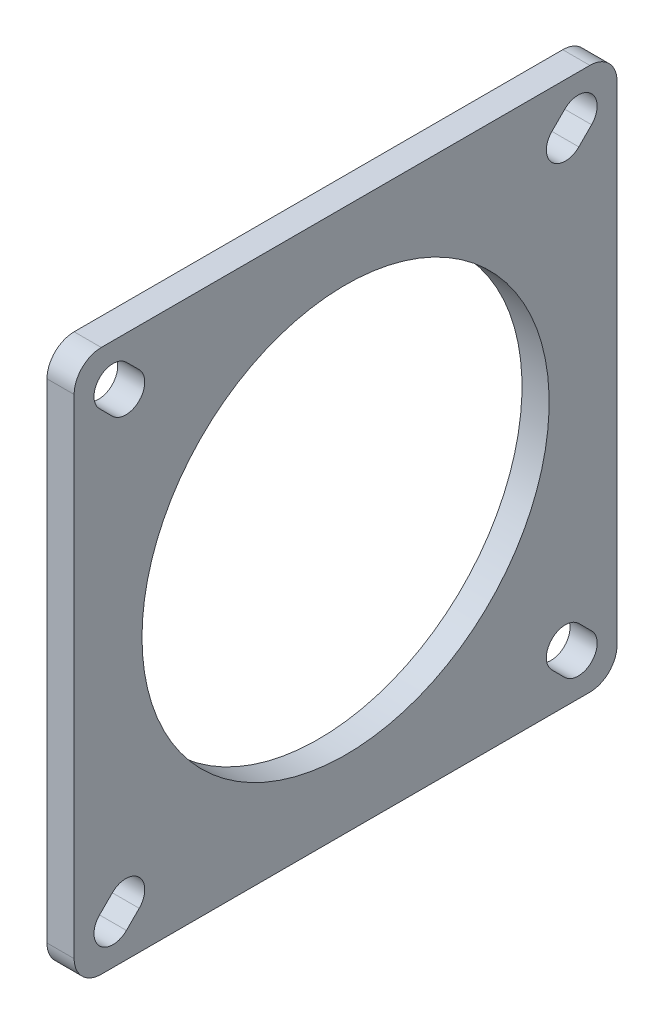
ISO-10303-21;
HEADER;
FILE_DESCRIPTION(('STEP AP214'),'2;1');
FILE_NAME('part.step','',(''),(''),'','','');
FILE_SCHEMA(('AUTOMOTIVE_DESIGN { 1 0 10303 214 1 1 1 1 }'));
ENDSEC;
DATA;
#1=APPLICATION_CONTEXT('core data for automotive mechanical design processes');
#2=APPLICATION_PROTOCOL_DEFINITION('international standard','automotive_design',2000,#1);
#3=PRODUCT_CONTEXT('',#1,'mechanical');
#4=PRODUCT('Part','Part','',(#3));
#5=PRODUCT_RELATED_PRODUCT_CATEGORY('part','',(#4));
#6=PRODUCT_DEFINITION_FORMATION('','',#4);
#7=PRODUCT_DEFINITION_CONTEXT('part definition',#1,'design');
#8=PRODUCT_DEFINITION('design','',#6,#7);
#9=PRODUCT_DEFINITION_SHAPE('','',#8);
#10=(LENGTH_UNIT() NAMED_UNIT(*) SI_UNIT(.MILLI.,.METRE.));
#11=(NAMED_UNIT(*) PLANE_ANGLE_UNIT() SI_UNIT($,.RADIAN.));
#12=(NAMED_UNIT(*) SI_UNIT($,.STERADIAN.) SOLID_ANGLE_UNIT());
#13=UNCERTAINTY_MEASURE_WITH_UNIT(LENGTH_MEASURE(1.E-05),#10,'distance_accuracy_value','');
#14=(GEOMETRIC_REPRESENTATION_CONTEXT(3) GLOBAL_UNCERTAINTY_ASSIGNED_CONTEXT((#13)) GLOBAL_UNIT_ASSIGNED_CONTEXT((#10,
#11,#12)) REPRESENTATION_CONTEXT('',''));
#15=CARTESIAN_POINT('',(0.,0.,0.));
#16=DIRECTION('',(0.,0.,1.));
#17=DIRECTION('',(1.,0.,0.));
#18=AXIS2_PLACEMENT_3D('',#15,#16,#17);
#19=CARTESIAN_POINT('',(0.,22.5,0.));
#20=DIRECTION('',(1.,0.,0.));
#21=DIRECTION('',(0.,0.,-1.));
#22=AXIS2_PLACEMENT_3D('',#19,#20,#21);
#23=PLANE('',#22);
#24=DIRECTION('',(0.,-0.707106781186549,-0.707106781186546));
#25=VECTOR('',#24,1.);
#26=CARTESIAN_POINT('',(0.,-27.1920310216784,-24.222182540695));
#27=LINE('',#26,#25);
#28=CARTESIAN_POINT('',(0.,-27.1920310216784,-24.222182540695));
#29=VERTEX_POINT('',#28);
#30=CARTESIAN_POINT('',(0.,-25.7778174593053,-22.8079689783219));
#31=VERTEX_POINT('',#30);
#32=EDGE_CURVE('E369',#29,#31,#27,.F.);
#33=ORIENTED_EDGE('',*,*,#32,.F.);
#34=CARTESIAN_POINT('',(0.,-25.7071067811866,-25.7071067811867));
#35=DIRECTION('',(-1.,0.,0.));
#36=DIRECTION('',(0.,0.,1.));
#37=AXIS2_PLACEMENT_3D('',#34,#35,#36);
#38=CIRCLE('',#37,2.1);
#39=CARTESIAN_POINT('',(0.,-24.2221825406949,-27.1920310216785));
#40=VERTEX_POINT('',#39);
#41=EDGE_CURVE('E216',#40,#29,#38,.T.);
#42=ORIENTED_EDGE('',*,*,#41,.F.);
#43=DIRECTION('',(0.,0.707106781186546,0.707106781186549));
#44=VECTOR('',#43,1.);
#45=CARTESIAN_POINT('',(0.,-24.2221825406949,-27.1920310216785));
#46=LINE('',#45,#44);
#47=CARTESIAN_POINT('',(0.,-22.8079689783218,-25.7778174593054));
#48=VERTEX_POINT('',#47);
#49=EDGE_CURVE('E373',#48,#40,#46,.F.);
#50=ORIENTED_EDGE('',*,*,#49,.F.);
#51=CARTESIAN_POINT('',(0.,-24.2928932188135,-24.2928932188136));
#52=DIRECTION('',(-1.,0.,0.));
#53=DIRECTION('',(0.,0.,1.));
#54=AXIS2_PLACEMENT_3D('',#51,#52,#53);
#55=CIRCLE('',#54,2.09999999999999);
#56=EDGE_CURVE('E371',#31,#48,#55,.T.);
#57=ORIENTED_EDGE('',*,*,#56,.F.);
#58=EDGE_LOOP('',(#33,#42,#50,#57));
#59=FACE_BOUND('',#58,.T.);
#60=DIRECTION('',(0.,-0.707106781186548,0.707106781186547));
#61=VECTOR('',#60,1.);
#62=CARTESIAN_POINT('',(0.,-24.2221825406951,27.1920310216783));
#63=LINE('',#62,#61);
#64=CARTESIAN_POINT('',(0.,-24.2221825406951,27.1920310216783));
#65=VERTEX_POINT('',#64);
#66=CARTESIAN_POINT('',(0.,-22.807968978322,25.7778174593052));
#67=VERTEX_POINT('',#66);
#68=EDGE_CURVE('E360',#65,#67,#63,.F.);
#69=ORIENTED_EDGE('',*,*,#68,.F.);
#70=CARTESIAN_POINT('',(0.,-25.7071067811868,25.7071067811865));
#71=DIRECTION('',(-1.,0.,0.));
#72=DIRECTION('',(0.,0.,1.));
#73=AXIS2_PLACEMENT_3D('',#70,#71,#72);
#74=CIRCLE('',#73,2.1);
#75=CARTESIAN_POINT('',(0.,-27.1920310216786,24.2221825406948));
#76=VERTEX_POINT('',#75);
#77=EDGE_CURVE('E366',#76,#65,#74,.T.);
#78=ORIENTED_EDGE('',*,*,#77,.F.);
#79=DIRECTION('',(0.,0.707106781186551,-0.707106781186544));
#80=VECTOR('',#79,1.);
#81=CARTESIAN_POINT('',(0.,-27.1920310216786,24.2221825406948));
#82=LINE('',#81,#80);
#83=CARTESIAN_POINT('',(0.,-25.7778174593055,22.8079689783217));
#84=VERTEX_POINT('',#83);
#85=EDGE_CURVE('E364',#84,#76,#82,.F.);
#86=ORIENTED_EDGE('',*,*,#85,.F.);
#87=CARTESIAN_POINT('',(0.,-24.2928932188137,24.2928932188135));
#88=DIRECTION('',(-1.,0.,0.));
#89=DIRECTION('',(0.,0.,1.));
#90=AXIS2_PLACEMENT_3D('',#87,#88,#89);
#91=CIRCLE('',#90,2.09999999999999);
#92=EDGE_CURVE('E362',#67,#84,#91,.T.);
#93=ORIENTED_EDGE('',*,*,#92,.F.);
#94=EDGE_LOOP('',(#69,#78,#86,#93));
#95=FACE_BOUND('',#94,.T.);
#96=DIRECTION('',(0.,0.707106781186554,0.707106781186541));
#97=VECTOR('',#96,1.);
#98=CARTESIAN_POINT('',(0.,27.1920310216786,24.2221825406948));
#99=LINE('',#98,#97);
#100=CARTESIAN_POINT('',(0.,27.1920310216786,24.2221825406948));
#101=VERTEX_POINT('',#100);
#102=CARTESIAN_POINT('',(0.,25.7778174593054,22.8079689783217));
#103=VERTEX_POINT('',#102);
#104=EDGE_CURVE('E246',#101,#103,#99,.F.);
#105=ORIENTED_EDGE('',*,*,#104,.F.);
#106=CARTESIAN_POINT('',(0.,25.7071067811868,25.7071067811866));
#107=DIRECTION('',(-1.,0.,0.));
#108=DIRECTION('',(0.,0.,1.));
#109=AXIS2_PLACEMENT_3D('',#106,#107,#108);
#110=CIRCLE('',#109,2.1);
#111=CARTESIAN_POINT('',(0.,24.2221825406951,27.1920310216783));
#112=VERTEX_POINT('',#111);
#113=EDGE_CURVE('E357',#112,#101,#110,.T.);
#114=ORIENTED_EDGE('',*,*,#113,.F.);
#115=DIRECTION('',(0.,-0.707106781186551,-0.707106781186544));
#116=VECTOR('',#115,1.);
#117=CARTESIAN_POINT('',(0.,24.2221825406951,27.1920310216783));
#118=LINE('',#117,#116);
#119=CARTESIAN_POINT('',(0.,22.807968978322,25.7778174593052));
#120=VERTEX_POINT('',#119);
#121=EDGE_CURVE('E355',#120,#112,#118,.F.);
#122=ORIENTED_EDGE('',*,*,#121,.F.);
#123=CARTESIAN_POINT('',(0.,24.2928932188137,24.2928932188135));
#124=DIRECTION('',(-1.,0.,0.));
#125=DIRECTION('',(0.,0.,1.));
#126=AXIS2_PLACEMENT_3D('',#123,#124,#125);
#127=CIRCLE('',#126,2.09999999999999);
#128=EDGE_CURVE('E353',#103,#120,#127,.T.);
#129=ORIENTED_EDGE('',*,*,#128,.F.);
#130=EDGE_LOOP('',(#105,#114,#122,#129));
#131=FACE_BOUND('',#130,.T.);
#132=DIRECTION('',(0.,0.707106781186548,-0.707106781186547));
#133=VECTOR('',#132,1.);
#134=CARTESIAN_POINT('',(0.,24.2221825406951,-27.1920310216783));
#135=LINE('',#134,#133);
#136=CARTESIAN_POINT('',(0.,24.2221825406951,-27.1920310216783));
#137=VERTEX_POINT('',#136);
#138=CARTESIAN_POINT('',(0.,22.807968978322,-25.7778174593052));
#139=VERTEX_POINT('',#138);
#140=EDGE_CURVE('E311',#137,#139,#135,.F.);
#141=ORIENTED_EDGE('',*,*,#140,.F.);
#142=CARTESIAN_POINT('',(0.,25.7071067811868,-25.7071067811865));
#143=DIRECTION('',(-1.,0.,0.));
#144=DIRECTION('',(0.,0.,1.));
#145=AXIS2_PLACEMENT_3D('',#142,#143,#144);
#146=CIRCLE('',#145,2.1);
#147=CARTESIAN_POINT('',(0.,27.1920310216786,-24.2221825406948));
#148=VERTEX_POINT('',#147);
#149=EDGE_CURVE('E319',#148,#137,#146,.T.);
#150=ORIENTED_EDGE('',*,*,#149,.F.);
#151=DIRECTION('',(0.,-0.707106781186551,0.707106781186544));
#152=VECTOR('',#151,1.);
#153=CARTESIAN_POINT('',(0.,27.1920310216786,-24.2221825406948));
#154=LINE('',#153,#152);
#155=CARTESIAN_POINT('',(0.,25.7778174593055,-22.8079689783217));
#156=VERTEX_POINT('',#155);
#157=EDGE_CURVE('E348',#156,#148,#154,.F.);
#158=ORIENTED_EDGE('',*,*,#157,.F.);
#159=CARTESIAN_POINT('',(0.,24.2928932188137,-24.2928932188135));
#160=DIRECTION('',(-1.,0.,0.));
#161=DIRECTION('',(0.,0.,1.));
#162=AXIS2_PLACEMENT_3D('',#159,#160,#161);
#163=CIRCLE('',#162,2.09999999999999);
#164=EDGE_CURVE('E346',#139,#156,#163,.T.);
#165=ORIENTED_EDGE('',*,*,#164,.F.);
#166=EDGE_LOOP('',(#141,#150,#158,#165));
#167=FACE_BOUND('',#166,.T.);
#168=CARTESIAN_POINT('',(0.,0.,0.));
#169=DIRECTION('',(-1.,0.,0.));
#170=DIRECTION('',(0.,0.,1.));
#171=AXIS2_PLACEMENT_3D('',#168,#169,#170);
#172=CIRCLE('',#171,22.5);
#173=CARTESIAN_POINT('',(0.,0.,22.5));
#174=VERTEX_POINT('',#173);
#175=EDGE_CURVE('E341',#174,#174,#172,.T.);
#176=ORIENTED_EDGE('',*,*,#175,.F.);
#177=EDGE_LOOP('',(#176));
#178=FACE_BOUND('',#177,.T.);
#179=DIRECTION('',(0.,1.,0.));
#180=VECTOR('',#179,1.);
#181=CARTESIAN_POINT('',(0.,22.5,-30.));
#182=LINE('',#181,#180);
#183=CARTESIAN_POINT('',(0.,-27.,-30.));
#184=VERTEX_POINT('',#183);
#185=CARTESIAN_POINT('',(0.,27.,-30.));
#186=VERTEX_POINT('',#185);
#187=EDGE_CURVE('E335',#184,#186,#182,.T.);
#188=ORIENTED_EDGE('',*,*,#187,.F.);
#189=CARTESIAN_POINT('',(0.,-27.,-27.));
#190=DIRECTION('',(1.,0.,0.));
#191=DIRECTION('',(0.,0.,-1.));
#192=AXIS2_PLACEMENT_3D('',#189,#190,#191);
#193=CIRCLE('',#192,3.);
#194=CARTESIAN_POINT('',(0.,-30.,-27.));
#195=VERTEX_POINT('',#194);
#196=EDGE_CURVE('E386',#184,#195,#193,.F.);
#197=ORIENTED_EDGE('',*,*,#196,.T.);
#198=DIRECTION('',(0.,0.,-1.));
#199=VECTOR('',#198,1.);
#200=CARTESIAN_POINT('',(0.,-30.,0.));
#201=LINE('',#200,#199);
#202=CARTESIAN_POINT('',(0.,-30.,27.));
#203=VERTEX_POINT('',#202);
#204=EDGE_CURVE('E327',#203,#195,#201,.T.);
#205=ORIENTED_EDGE('',*,*,#204,.F.);
#206=CARTESIAN_POINT('',(0.,-27.,27.));
#207=DIRECTION('',(1.,0.,0.));
#208=DIRECTION('',(0.,0.,-1.));
#209=AXIS2_PLACEMENT_3D('',#206,#207,#208);
#210=CIRCLE('',#209,3.);
#211=CARTESIAN_POINT('',(0.,-27.,30.));
#212=VERTEX_POINT('',#211);
#213=EDGE_CURVE('E384',#203,#212,#210,.F.);
#214=ORIENTED_EDGE('',*,*,#213,.T.);
#215=DIRECTION('',(0.,-1.,0.));
#216=VECTOR('',#215,1.);
#217=CARTESIAN_POINT('',(0.,22.5,30.));
#218=LINE('',#217,#216);
#219=CARTESIAN_POINT('',(0.,27.,30.));
#220=VERTEX_POINT('',#219);
#221=EDGE_CURVE('E330',#220,#212,#218,.T.);
#222=ORIENTED_EDGE('',*,*,#221,.F.);
#223=CARTESIAN_POINT('',(0.,27.,27.));
#224=DIRECTION('',(1.,0.,0.));
#225=DIRECTION('',(0.,0.,-1.));
#226=AXIS2_PLACEMENT_3D('',#223,#224,#225);
#227=CIRCLE('',#226,3.);
#228=CARTESIAN_POINT('',(0.,30.,27.));
#229=VERTEX_POINT('',#228);
#230=EDGE_CURVE('E382',#220,#229,#227,.F.);
#231=ORIENTED_EDGE('',*,*,#230,.T.);
#232=DIRECTION('',(0.,0.,1.));
#233=VECTOR('',#232,1.);
#234=CARTESIAN_POINT('',(0.,30.,0.));
#235=LINE('',#234,#233);
#236=CARTESIAN_POINT('',(0.,30.,-27.));
#237=VERTEX_POINT('',#236);
#238=EDGE_CURVE('E332',#237,#229,#235,.T.);
#239=ORIENTED_EDGE('',*,*,#238,.F.);
#240=CARTESIAN_POINT('',(0.,27.,-27.));
#241=DIRECTION('',(1.,0.,0.));
#242=DIRECTION('',(0.,0.,-1.));
#243=AXIS2_PLACEMENT_3D('',#240,#241,#242);
#244=CIRCLE('',#243,3.);
#245=EDGE_CURVE('E380',#237,#186,#244,.F.);
#246=ORIENTED_EDGE('',*,*,#245,.T.);
#247=EDGE_LOOP('',(#188,#197,#205,#214,#222,#231,#239,#246));
#248=FACE_BOUND('',#247,.T.);
#249=ADVANCED_FACE('F46',(#59,#95,#131,#167,#178,#248),#23,.F.);
#250=CARTESIAN_POINT('',(3.,50.,0.));
#251=DIRECTION('',(-1.,0.,0.));
#252=DIRECTION('',(0.,0.,1.));
#253=AXIS2_PLACEMENT_3D('',#250,#251,#252);
#254=PLANE('',#253);
#255=DIRECTION('',(0.,-0.707106781186546,-0.707106781186549));
#256=VECTOR('',#255,1.);
#257=CARTESIAN_POINT('',(3.00000000000001,-24.2221825406949,-27.1920310216785));
#258=LINE('',#257,#256);
#259=CARTESIAN_POINT('',(3.00000000000001,-22.8079689783218,-25.7778174593054));
#260=VERTEX_POINT('',#259);
#261=CARTESIAN_POINT('',(3.00000000000001,-24.2221825406949,-27.1920310216785));
#262=VERTEX_POINT('',#261);
#263=EDGE_CURVE('E220',#260,#262,#258,.T.);
#264=ORIENTED_EDGE('',*,*,#263,.T.);
#265=CARTESIAN_POINT('',(3.00000000000001,-25.7071067811866,-25.7071067811867));
#266=DIRECTION('',(-1.,0.,0.));
#267=DIRECTION('',(0.,1.,0.));
#268=AXIS2_PLACEMENT_3D('',#265,#266,#267);
#269=CIRCLE('',#268,2.1);
#270=CARTESIAN_POINT('',(3.00000000000001,-27.1920310216784,-24.222182540695));
#271=VERTEX_POINT('',#270);
#272=EDGE_CURVE('E213',#262,#271,#269,.T.);
#273=ORIENTED_EDGE('',*,*,#272,.T.);
#274=DIRECTION('',(0.,0.707106781186549,0.707106781186546));
#275=VECTOR('',#274,1.);
#276=CARTESIAN_POINT('',(3.00000000000001,-27.1920310216784,-24.222182540695));
#277=LINE('',#276,#275);
#278=CARTESIAN_POINT('',(3.,-25.7778174593053,-22.8079689783219));
#279=VERTEX_POINT('',#278);
#280=EDGE_CURVE('E224',#271,#279,#277,.T.);
#281=ORIENTED_EDGE('',*,*,#280,.T.);
#282=CARTESIAN_POINT('',(3.00000000000001,-24.2928932188135,-24.2928932188136));
#283=DIRECTION('',(-1.,0.,0.));
#284=DIRECTION('',(0.,1.,0.));
#285=AXIS2_PLACEMENT_3D('',#282,#283,#284);
#286=CIRCLE('',#285,2.09999999999999);
#287=EDGE_CURVE('E229',#279,#260,#286,.T.);
#288=ORIENTED_EDGE('',*,*,#287,.T.);
#289=EDGE_LOOP('',(#264,#273,#281,#288));
#290=FACE_BOUND('',#289,.T.);
#291=DIRECTION('',(0.,-0.707106781186551,0.707106781186544));
#292=VECTOR('',#291,1.);
#293=CARTESIAN_POINT('',(3.00000000000001,-27.1920310216786,24.2221825406948));
#294=LINE('',#293,#292);
#295=CARTESIAN_POINT('',(3.00000000000001,-25.7778174593055,22.8079689783217));
#296=VERTEX_POINT('',#295);
#297=CARTESIAN_POINT('',(3.00000000000001,-27.1920310216786,24.2221825406948));
#298=VERTEX_POINT('',#297);
#299=EDGE_CURVE('E259',#296,#298,#294,.T.);
#300=ORIENTED_EDGE('',*,*,#299,.T.);
#301=CARTESIAN_POINT('',(3.00000000000001,-25.7071067811868,25.7071067811865));
#302=DIRECTION('',(-1.,0.,0.));
#303=DIRECTION('',(0.,0.,-1.));
#304=AXIS2_PLACEMENT_3D('',#301,#302,#303);
#305=CIRCLE('',#304,2.1);
#306=CARTESIAN_POINT('',(3.00000000000001,-24.2221825406951,27.1920310216783));
#307=VERTEX_POINT('',#306);
#308=EDGE_CURVE('E249',#298,#307,#305,.T.);
#309=ORIENTED_EDGE('',*,*,#308,.T.);
#310=DIRECTION('',(0.,0.707106781186548,-0.707106781186547));
#311=VECTOR('',#310,1.);
#312=CARTESIAN_POINT('',(3.00000000000001,-24.2221825406951,27.1920310216783));
#313=LINE('',#312,#311);
#314=CARTESIAN_POINT('',(3.,-22.807968978322,25.7778174593052));
#315=VERTEX_POINT('',#314);
#316=EDGE_CURVE('E252',#307,#315,#313,.T.);
#317=ORIENTED_EDGE('',*,*,#316,.T.);
#318=CARTESIAN_POINT('',(3.00000000000001,-24.2928932188137,24.2928932188135));
#319=DIRECTION('',(-1.,0.,0.));
#320=DIRECTION('',(0.,0.,-1.));
#321=AXIS2_PLACEMENT_3D('',#318,#319,#320);
#322=CIRCLE('',#321,2.09999999999999);
#323=EDGE_CURVE('E256',#315,#296,#322,.T.);
#324=ORIENTED_EDGE('',*,*,#323,.T.);
#325=EDGE_LOOP('',(#300,#309,#317,#324));
#326=FACE_BOUND('',#325,.T.);
#327=DIRECTION('',(0.,0.707106781186551,0.707106781186544));
#328=VECTOR('',#327,1.);
#329=CARTESIAN_POINT('',(3.00000000000001,24.2221825406951,27.1920310216783));
#330=LINE('',#329,#328);
#331=CARTESIAN_POINT('',(3.00000000000001,22.807968978322,25.7778174593052));
#332=VERTEX_POINT('',#331);
#333=CARTESIAN_POINT('',(3.00000000000001,24.2221825406951,27.1920310216783));
#334=VERTEX_POINT('',#333);
#335=EDGE_CURVE('E278',#332,#334,#330,.T.);
#336=ORIENTED_EDGE('',*,*,#335,.T.);
#337=CARTESIAN_POINT('',(3.00000000000001,25.7071067811868,25.7071067811866));
#338=DIRECTION('',(-1.,0.,0.));
#339=DIRECTION('',(0.,-1.,0.));
#340=AXIS2_PLACEMENT_3D('',#337,#338,#339);
#341=CIRCLE('',#340,2.1);
#342=CARTESIAN_POINT('',(3.00000000000001,27.1920310216786,24.2221825406948));
#343=VERTEX_POINT('',#342);
#344=EDGE_CURVE('E269',#334,#343,#341,.T.);
#345=ORIENTED_EDGE('',*,*,#344,.T.);
#346=DIRECTION('',(0.,-0.707106781186554,-0.707106781186541));
#347=VECTOR('',#346,1.);
#348=CARTESIAN_POINT('',(3.00000000000001,27.1920310216786,24.2221825406948));
#349=LINE('',#348,#347);
#350=CARTESIAN_POINT('',(3.,25.7778174593054,22.8079689783217));
#351=VERTEX_POINT('',#350);
#352=EDGE_CURVE('E272',#343,#351,#349,.T.);
#353=ORIENTED_EDGE('',*,*,#352,.T.);
#354=CARTESIAN_POINT('',(3.00000000000001,24.2928932188137,24.2928932188135));
#355=DIRECTION('',(-1.,0.,0.));
#356=DIRECTION('',(0.,-1.,0.));
#357=AXIS2_PLACEMENT_3D('',#354,#355,#356);
#358=CIRCLE('',#357,2.09999999999999);
#359=EDGE_CURVE('E275',#351,#332,#358,.T.);
#360=ORIENTED_EDGE('',*,*,#359,.T.);
#361=EDGE_LOOP('',(#336,#345,#353,#360));
#362=FACE_BOUND('',#361,.T.);
#363=DIRECTION('',(0.,0.707106781186551,-0.707106781186544));
#364=VECTOR('',#363,1.);
#365=CARTESIAN_POINT('',(3.00000000000001,27.1920310216786,-24.2221825406948));
#366=LINE('',#365,#364);
#367=CARTESIAN_POINT('',(3.00000000000001,25.7778174593055,-22.8079689783217));
#368=VERTEX_POINT('',#367);
#369=CARTESIAN_POINT('',(3.00000000000001,27.1920310216786,-24.2221825406948));
#370=VERTEX_POINT('',#369);
#371=EDGE_CURVE('E300',#368,#370,#366,.T.);
#372=ORIENTED_EDGE('',*,*,#371,.T.);
#373=CARTESIAN_POINT('',(3.00000000000001,25.7071067811868,-25.7071067811865));
#374=DIRECTION('',(-1.,0.,0.));
#375=DIRECTION('',(0.,0.,1.));
#376=AXIS2_PLACEMENT_3D('',#373,#374,#375);
#377=CIRCLE('',#376,2.1);
#378=CARTESIAN_POINT('',(3.00000000000001,24.2221825406951,-27.1920310216783));
#379=VERTEX_POINT('',#378);
#380=EDGE_CURVE('E291',#370,#379,#377,.T.);
#381=ORIENTED_EDGE('',*,*,#380,.T.);
#382=DIRECTION('',(0.,-0.707106781186548,0.707106781186547));
#383=VECTOR('',#382,1.);
#384=CARTESIAN_POINT('',(3.00000000000001,24.2221825406951,-27.1920310216783));
#385=LINE('',#384,#383);
#386=CARTESIAN_POINT('',(3.,22.807968978322,-25.7778174593052));
#387=VERTEX_POINT('',#386);
#388=EDGE_CURVE('E294',#379,#387,#385,.T.);
#389=ORIENTED_EDGE('',*,*,#388,.T.);
#390=CARTESIAN_POINT('',(3.00000000000001,24.2928932188137,-24.2928932188135));
#391=DIRECTION('',(-1.,0.,0.));
#392=DIRECTION('',(0.,0.,1.));
#393=AXIS2_PLACEMENT_3D('',#390,#391,#392);
#394=CIRCLE('',#393,2.09999999999999);
#395=EDGE_CURVE('E297',#387,#368,#394,.T.);
#396=ORIENTED_EDGE('',*,*,#395,.T.);
#397=EDGE_LOOP('',(#372,#381,#389,#396));
#398=FACE_BOUND('',#397,.T.);
#399=CARTESIAN_POINT('',(3.00000000000001,0.,0.));
#400=DIRECTION('',(-1.,0.,0.));
#401=DIRECTION('',(0.,0.,1.));
#402=AXIS2_PLACEMENT_3D('',#399,#400,#401);
#403=CIRCLE('',#402,22.5);
#404=CARTESIAN_POINT('',(3.00000000000001,0.,22.5));
#405=VERTEX_POINT('',#404);
#406=EDGE_CURVE('E338',#405,#405,#403,.T.);
#407=ORIENTED_EDGE('',*,*,#406,.T.);
#408=EDGE_LOOP('',(#407));
#409=FACE_BOUND('',#408,.T.);
#410=DIRECTION('',(0.,0.,1.));
#411=VECTOR('',#410,1.);
#412=CARTESIAN_POINT('',(3.00000000000001,-30.,30.));
#413=LINE('',#412,#411);
#414=CARTESIAN_POINT('',(3.00000000000001,-30.,-27.));
#415=VERTEX_POINT('',#414);
#416=CARTESIAN_POINT('',(3.00000000000001,-30.,27.));
#417=VERTEX_POINT('',#416);
#418=EDGE_CURVE('E318',#415,#417,#413,.T.);
#419=ORIENTED_EDGE('',*,*,#418,.F.);
#420=CARTESIAN_POINT('',(3.,-27.,-27.));
#421=DIRECTION('',(-1.,0.,0.));
#422=DIRECTION('',(0.,0.,1.));
#423=AXIS2_PLACEMENT_3D('',#420,#421,#422);
#424=CIRCLE('',#423,3.);
#425=CARTESIAN_POINT('',(3.00000000000001,-27.,-30.));
#426=VERTEX_POINT('',#425);
#427=EDGE_CURVE('E398',#415,#426,#424,.F.);
#428=ORIENTED_EDGE('',*,*,#427,.T.);
#429=DIRECTION('',(0.,-1.,0.));
#430=VECTOR('',#429,1.);
#431=CARTESIAN_POINT('',(3.00000000000001,-30.,-30.));
#432=LINE('',#431,#430);
#433=CARTESIAN_POINT('',(3.00000000000001,27.,-30.));
#434=VERTEX_POINT('',#433);
#435=EDGE_CURVE('E315',#434,#426,#432,.T.);
#436=ORIENTED_EDGE('',*,*,#435,.F.);
#437=CARTESIAN_POINT('',(3.,27.,-27.));
#438=DIRECTION('',(-1.,0.,0.));
#439=DIRECTION('',(0.,0.,1.));
#440=AXIS2_PLACEMENT_3D('',#437,#438,#439);
#441=CIRCLE('',#440,3.);
#442=CARTESIAN_POINT('',(3.00000000000001,30.,-27.));
#443=VERTEX_POINT('',#442);
#444=EDGE_CURVE('E393',#434,#443,#441,.F.);
#445=ORIENTED_EDGE('',*,*,#444,.T.);
#446=DIRECTION('',(0.,0.,-1.));
#447=VECTOR('',#446,1.);
#448=CARTESIAN_POINT('',(3.00000000000001,30.,30.));
#449=LINE('',#448,#447);
#450=CARTESIAN_POINT('',(3.00000000000001,30.,27.));
#451=VERTEX_POINT('',#450);
#452=EDGE_CURVE('E324',#451,#443,#449,.T.);
#453=ORIENTED_EDGE('',*,*,#452,.F.);
#454=CARTESIAN_POINT('',(3.,27.,27.));
#455=DIRECTION('',(-1.,0.,0.));
#456=DIRECTION('',(0.,0.,1.));
#457=AXIS2_PLACEMENT_3D('',#454,#455,#456);
#458=CIRCLE('',#457,3.);
#459=CARTESIAN_POINT('',(3.00000000000001,27.,30.));
#460=VERTEX_POINT('',#459);
#461=EDGE_CURVE('E61',#451,#460,#458,.F.);
#462=ORIENTED_EDGE('',*,*,#461,.T.);
#463=DIRECTION('',(0.,1.,0.));
#464=VECTOR('',#463,1.);
#465=CARTESIAN_POINT('',(3.00000000000001,-30.,30.));
#466=LINE('',#465,#464);
#467=CARTESIAN_POINT('',(3.00000000000001,-27.,30.));
#468=VERTEX_POINT('',#467);
#469=EDGE_CURVE('E322',#468,#460,#466,.T.);
#470=ORIENTED_EDGE('',*,*,#469,.F.);
#471=CARTESIAN_POINT('',(3.,-27.,27.));
#472=DIRECTION('',(-1.,0.,0.));
#473=DIRECTION('',(0.,0.,1.));
#474=AXIS2_PLACEMENT_3D('',#471,#472,#473);
#475=CIRCLE('',#474,3.);
#476=EDGE_CURVE('E396',#468,#417,#475,.F.);
#477=ORIENTED_EDGE('',*,*,#476,.T.);
#478=EDGE_LOOP('',(#419,#428,#436,#445,#453,#462,#470,#477));
#479=FACE_BOUND('',#478,.T.);
#480=ADVANCED_FACE('F231',(#290,#326,#362,#398,#409,#479),#254,.F.);
#481=CARTESIAN_POINT('',(-29.3651203100726,0.,0.));
#482=DIRECTION('',(-1.,0.,0.));
#483=DIRECTION('',(0.,0.,1.));
#484=AXIS2_PLACEMENT_3D('',#481,#482,#483);
#485=CYLINDRICAL_SURFACE('',#484,22.5);
#486=ORIENTED_EDGE('',*,*,#406,.F.);
#487=EDGE_LOOP('',(#486));
#488=FACE_BOUND('',#487,.T.);
#489=ORIENTED_EDGE('',*,*,#175,.T.);
#490=EDGE_LOOP('',(#489));
#491=FACE_BOUND('',#490,.T.);
#492=ADVANCED_FACE('F446',(#488,#491),#485,.F.);
#493=CARTESIAN_POINT('',(3.00000000000001,-30.,-30.));
#494=DIRECTION('',(0.,0.,-1.));
#495=DIRECTION('',(-1.,0.,0.));
#496=AXIS2_PLACEMENT_3D('',#493,#494,#495);
#497=PLANE('',#496);
#498=ORIENTED_EDGE('',*,*,#435,.T.);
#499=DIRECTION('',(-1.,0.,0.));
#500=VECTOR('',#499,1.);
#501=CARTESIAN_POINT('',(3.00000000000001,-27.,-30.));
#502=LINE('',#501,#500);
#503=EDGE_CURVE('E377',#426,#184,#502,.T.);
#504=ORIENTED_EDGE('',*,*,#503,.T.);
#505=ORIENTED_EDGE('',*,*,#187,.T.);
#506=DIRECTION('',(-1.,0.,0.));
#507=VECTOR('',#506,1.);
#508=CARTESIAN_POINT('',(3.00000000000001,27.,-30.));
#509=LINE('',#508,#507);
#510=EDGE_CURVE('E344',#186,#434,#509,.F.);
#511=ORIENTED_EDGE('',*,*,#510,.T.);
#512=EDGE_LOOP('',(#498,#504,#505,#511));
#513=FACE_BOUND('',#512,.T.);
#514=ADVANCED_FACE('F432',(#513),#497,.T.);
#515=CARTESIAN_POINT('',(3.00000000000001,30.,30.));
#516=DIRECTION('',(0.,1.,0.));
#517=DIRECTION('',(0.,0.,1.));
#518=AXIS2_PLACEMENT_3D('',#515,#516,#517);
#519=PLANE('',#518);
#520=ORIENTED_EDGE('',*,*,#238,.T.);
#521=DIRECTION('',(-1.,0.,0.));
#522=VECTOR('',#521,1.);
#523=CARTESIAN_POINT('',(3.00000000000001,30.,27.));
#524=LINE('',#523,#522);
#525=EDGE_CURVE('E11',#229,#451,#524,.F.);
#526=ORIENTED_EDGE('',*,*,#525,.T.);
#527=ORIENTED_EDGE('',*,*,#452,.T.);
#528=DIRECTION('',(-1.,0.,0.));
#529=VECTOR('',#528,1.);
#530=CARTESIAN_POINT('',(3.00000000000001,30.,-27.));
#531=LINE('',#530,#529);
#532=EDGE_CURVE('E54',#443,#237,#531,.T.);
#533=ORIENTED_EDGE('',*,*,#532,.T.);
#534=EDGE_LOOP('',(#520,#526,#527,#533));
#535=FACE_BOUND('',#534,.T.);
#536=ADVANCED_FACE('F407',(#535),#519,.T.);
#537=CARTESIAN_POINT('',(3.00000000000001,-30.,30.));
#538=DIRECTION('',(0.,0.,1.));
#539=DIRECTION('',(0.,-1.,0.));
#540=AXIS2_PLACEMENT_3D('',#537,#538,#539);
#541=PLANE('',#540);
#542=ORIENTED_EDGE('',*,*,#221,.T.);
#543=DIRECTION('',(-1.,0.,0.));
#544=VECTOR('',#543,1.);
#545=CARTESIAN_POINT('',(3.00000000000001,-27.,30.));
#546=LINE('',#545,#544);
#547=EDGE_CURVE('E68',#212,#468,#546,.F.);
#548=ORIENTED_EDGE('',*,*,#547,.T.);
#549=ORIENTED_EDGE('',*,*,#469,.T.);
#550=DIRECTION('',(-1.,0.,0.));
#551=VECTOR('',#550,1.);
#552=CARTESIAN_POINT('',(3.00000000000001,27.,30.));
#553=LINE('',#552,#551);
#554=EDGE_CURVE('E400',#460,#220,#553,.T.);
#555=ORIENTED_EDGE('',*,*,#554,.T.);
#556=EDGE_LOOP('',(#542,#548,#549,#555));
#557=FACE_BOUND('',#556,.T.);
#558=ADVANCED_FACE('F417',(#557),#541,.T.);
#559=CARTESIAN_POINT('',(3.00000000000001,-30.,30.));
#560=DIRECTION('',(0.,-1.,0.));
#561=DIRECTION('',(0.,0.,-1.));
#562=AXIS2_PLACEMENT_3D('',#559,#560,#561);
#563=PLANE('',#562);
#564=ORIENTED_EDGE('',*,*,#204,.T.);
#565=DIRECTION('',(-1.,0.,0.));
#566=VECTOR('',#565,1.);
#567=CARTESIAN_POINT('',(3.00000000000001,-30.,-27.));
#568=LINE('',#567,#566);
#569=EDGE_CURVE('E391',#195,#415,#568,.F.);
#570=ORIENTED_EDGE('',*,*,#569,.T.);
#571=ORIENTED_EDGE('',*,*,#418,.T.);
#572=DIRECTION('',(-1.,0.,0.));
#573=VECTOR('',#572,1.);
#574=CARTESIAN_POINT('',(3.00000000000001,-30.,27.));
#575=LINE('',#574,#573);
#576=EDGE_CURVE('E388',#417,#203,#575,.T.);
#577=ORIENTED_EDGE('',*,*,#576,.T.);
#578=EDGE_LOOP('',(#564,#570,#571,#577));
#579=FACE_BOUND('',#578,.T.);
#580=ADVANCED_FACE('F425',(#579),#563,.T.);
#581=CARTESIAN_POINT('',(3.00000000000001,25.7071067811868,-25.7071067811865));
#582=DIRECTION('',(-1.,0.,0.));
#583=DIRECTION('',(0.,0.,1.));
#584=AXIS2_PLACEMENT_3D('',#581,#582,#583);
#585=CYLINDRICAL_SURFACE('',#584,2.1);
#586=DIRECTION('',(-1.,0.,0.));
#587=VECTOR('',#586,1.);
#588=CARTESIAN_POINT('',(3.00000000000001,24.2221825406951,-27.1920310216783));
#589=LINE('',#588,#587);
#590=EDGE_CURVE('E303',#379,#137,#589,.T.);
#591=ORIENTED_EDGE('',*,*,#590,.F.);
#592=ORIENTED_EDGE('',*,*,#380,.F.);
#593=DIRECTION('',(-1.,0.,0.));
#594=VECTOR('',#593,1.);
#595=CARTESIAN_POINT('',(3.00000000000001,27.1920310216786,-24.2221825406948));
#596=LINE('',#595,#594);
#597=EDGE_CURVE('E307',#370,#148,#596,.T.);
#598=ORIENTED_EDGE('',*,*,#597,.T.);
#599=ORIENTED_EDGE('',*,*,#149,.T.);
#600=EDGE_LOOP('',(#591,#592,#598,#599));
#601=FACE_BOUND('',#600,.T.);
#602=ADVANCED_FACE('F607',(#601),#585,.F.);
#603=CARTESIAN_POINT('',(3.00000000000001,27.1920310216786,-24.2221825406948));
#604=DIRECTION('',(0.,0.707106781186544,0.707106781186551));
#605=DIRECTION('',(0.,-0.707106781186551,0.707106781186544));
#606=AXIS2_PLACEMENT_3D('',#603,#604,#605);
#607=PLANE('',#606);
#608=ORIENTED_EDGE('',*,*,#597,.F.);
#609=ORIENTED_EDGE('',*,*,#371,.F.);
#610=DIRECTION('',(-1.,0.,0.));
#611=VECTOR('',#610,1.);
#612=CARTESIAN_POINT('',(3.00000000000001,25.7778174593055,-22.8079689783217));
#613=LINE('',#612,#611);
#614=EDGE_CURVE('E304',#368,#156,#613,.T.);
#615=ORIENTED_EDGE('',*,*,#614,.T.);
#616=ORIENTED_EDGE('',*,*,#157,.T.);
#617=EDGE_LOOP('',(#608,#609,#615,#616));
#618=FACE_BOUND('',#617,.T.);
#619=ADVANCED_FACE('F598',(#618),#607,.F.);
#620=CARTESIAN_POINT('',(3.00000000000001,24.2928932188137,-24.2928932188135));
#621=DIRECTION('',(-1.,0.,0.));
#622=DIRECTION('',(0.,0.,1.));
#623=AXIS2_PLACEMENT_3D('',#620,#621,#622);
#624=CYLINDRICAL_SURFACE('',#623,2.09999999999999);
#625=ORIENTED_EDGE('',*,*,#614,.F.);
#626=ORIENTED_EDGE('',*,*,#395,.F.);
#627=DIRECTION('',(-1.,0.,0.));
#628=VECTOR('',#627,1.);
#629=CARTESIAN_POINT('',(3.00000000000001,22.807968978322,-25.7778174593052));
#630=LINE('',#629,#628);
#631=EDGE_CURVE('E308',#387,#139,#630,.T.);
#632=ORIENTED_EDGE('',*,*,#631,.T.);
#633=ORIENTED_EDGE('',*,*,#164,.T.);
#634=EDGE_LOOP('',(#625,#626,#632,#633));
#635=FACE_BOUND('',#634,.T.);
#636=ADVANCED_FACE('F589',(#635),#624,.F.);
#637=CARTESIAN_POINT('',(3.00000000000001,24.2221825406951,-27.1920310216783));
#638=DIRECTION('',(0.,-0.707106781186547,-0.707106781186548));
#639=DIRECTION('',(0.,0.707106781186548,-0.707106781186547));
#640=AXIS2_PLACEMENT_3D('',#637,#638,#639);
#641=PLANE('',#640);
#642=ORIENTED_EDGE('',*,*,#631,.F.);
#643=ORIENTED_EDGE('',*,*,#388,.F.);
#644=ORIENTED_EDGE('',*,*,#590,.T.);
#645=ORIENTED_EDGE('',*,*,#140,.T.);
#646=EDGE_LOOP('',(#642,#643,#644,#645));
#647=FACE_BOUND('',#646,.T.);
#648=ADVANCED_FACE('F580',(#647),#641,.F.);
#649=CARTESIAN_POINT('',(3.00000000000001,25.7071067811868,25.7071067811866));
#650=DIRECTION('',(-1.,0.,0.));
#651=DIRECTION('',(0.,0.,1.));
#652=AXIS2_PLACEMENT_3D('',#649,#650,#651);
#653=CYLINDRICAL_SURFACE('',#652,2.1);
#654=DIRECTION('',(-1.,0.,0.));
#655=VECTOR('',#654,1.);
#656=CARTESIAN_POINT('',(3.00000000000001,27.1920310216786,24.2221825406948));
#657=LINE('',#656,#655);
#658=EDGE_CURVE('E281',#343,#101,#657,.T.);
#659=ORIENTED_EDGE('',*,*,#658,.F.);
#660=ORIENTED_EDGE('',*,*,#344,.F.);
#661=DIRECTION('',(-1.,0.,0.));
#662=VECTOR('',#661,1.);
#663=CARTESIAN_POINT('',(3.00000000000001,24.2221825406951,27.1920310216783));
#664=LINE('',#663,#662);
#665=EDGE_CURVE('E253',#334,#112,#664,.T.);
#666=ORIENTED_EDGE('',*,*,#665,.T.);
#667=ORIENTED_EDGE('',*,*,#113,.T.);
#668=EDGE_LOOP('',(#659,#660,#666,#667));
#669=FACE_BOUND('',#668,.T.);
#670=ADVANCED_FACE('F571',(#669),#653,.F.);
#671=CARTESIAN_POINT('',(3.00000000000001,24.2221825406951,27.1920310216783));
#672=DIRECTION('',(0.,-0.707106781186544,0.707106781186551));
#673=DIRECTION('',(0.,-0.707106781186551,-0.707106781186544));
#674=AXIS2_PLACEMENT_3D('',#671,#672,#673);
#675=PLANE('',#674);
#676=ORIENTED_EDGE('',*,*,#665,.F.);
#677=ORIENTED_EDGE('',*,*,#335,.F.);
#678=DIRECTION('',(-1.,0.,0.));
#679=VECTOR('',#678,1.);
#680=CARTESIAN_POINT('',(3.00000000000001,22.807968978322,25.7778174593052));
#681=LINE('',#680,#679);
#682=EDGE_CURVE('E282',#332,#120,#681,.T.);
#683=ORIENTED_EDGE('',*,*,#682,.T.);
#684=ORIENTED_EDGE('',*,*,#121,.T.);
#685=EDGE_LOOP('',(#676,#677,#683,#684));
#686=FACE_BOUND('',#685,.T.);
#687=ADVANCED_FACE('F562',(#686),#675,.F.);
#688=CARTESIAN_POINT('',(3.00000000000001,24.2928932188137,24.2928932188135));
#689=DIRECTION('',(-1.,0.,0.));
#690=DIRECTION('',(0.,0.,1.));
#691=AXIS2_PLACEMENT_3D('',#688,#689,#690);
#692=CYLINDRICAL_SURFACE('',#691,2.09999999999999);
#693=ORIENTED_EDGE('',*,*,#682,.F.);
#694=ORIENTED_EDGE('',*,*,#359,.F.);
#695=DIRECTION('',(-1.,0.,0.));
#696=VECTOR('',#695,1.);
#697=CARTESIAN_POINT('',(3.00000000000001,25.7778174593054,22.8079689783217));
#698=LINE('',#697,#696);
#699=EDGE_CURVE('E285',#351,#103,#698,.T.);
#700=ORIENTED_EDGE('',*,*,#699,.T.);
#701=ORIENTED_EDGE('',*,*,#128,.T.);
#702=EDGE_LOOP('',(#693,#694,#700,#701));
#703=FACE_BOUND('',#702,.T.);
#704=ADVANCED_FACE('F553',(#703),#692,.F.);
#705=CARTESIAN_POINT('',(3.00000000000001,27.1920310216786,24.2221825406948));
#706=DIRECTION('',(0.,0.707106781186541,-0.707106781186554));
#707=DIRECTION('',(0.,0.707106781186554,0.707106781186541));
#708=AXIS2_PLACEMENT_3D('',#705,#706,#707);
#709=PLANE('',#708);
#710=ORIENTED_EDGE('',*,*,#699,.F.);
#711=ORIENTED_EDGE('',*,*,#352,.F.);
#712=ORIENTED_EDGE('',*,*,#658,.T.);
#713=ORIENTED_EDGE('',*,*,#104,.T.);
#714=EDGE_LOOP('',(#710,#711,#712,#713));
#715=FACE_BOUND('',#714,.T.);
#716=ADVANCED_FACE('F544',(#715),#709,.F.);
#717=CARTESIAN_POINT('',(3.00000000000001,-25.7071067811868,25.7071067811865));
#718=DIRECTION('',(-1.,0.,0.));
#719=DIRECTION('',(0.,0.,1.));
#720=AXIS2_PLACEMENT_3D('',#717,#718,#719);
#721=CYLINDRICAL_SURFACE('',#720,2.1);
#722=DIRECTION('',(-1.,0.,0.));
#723=VECTOR('',#722,1.);
#724=CARTESIAN_POINT('',(3.00000000000001,-24.2221825406951,27.1920310216783));
#725=LINE('',#724,#723);
#726=EDGE_CURVE('E262',#307,#65,#725,.T.);
#727=ORIENTED_EDGE('',*,*,#726,.F.);
#728=ORIENTED_EDGE('',*,*,#308,.F.);
#729=DIRECTION('',(-1.,0.,0.));
#730=VECTOR('',#729,1.);
#731=CARTESIAN_POINT('',(3.00000000000001,-27.1920310216786,24.2221825406948));
#732=LINE('',#731,#730);
#733=EDGE_CURVE('E234',#298,#76,#732,.T.);
#734=ORIENTED_EDGE('',*,*,#733,.T.);
#735=ORIENTED_EDGE('',*,*,#77,.T.);
#736=EDGE_LOOP('',(#727,#728,#734,#735));
#737=FACE_BOUND('',#736,.T.);
#738=ADVANCED_FACE('F535',(#737),#721,.F.);
#739=CARTESIAN_POINT('',(3.00000000000001,-27.1920310216786,24.2221825406948));
#740=DIRECTION('',(0.,-0.707106781186544,-0.707106781186551));
#741=DIRECTION('',(0.,0.707106781186551,-0.707106781186544));
#742=AXIS2_PLACEMENT_3D('',#739,#740,#741);
#743=PLANE('',#742);
#744=ORIENTED_EDGE('',*,*,#733,.F.);
#745=ORIENTED_EDGE('',*,*,#299,.F.);
#746=DIRECTION('',(-1.,0.,0.));
#747=VECTOR('',#746,1.);
#748=CARTESIAN_POINT('',(3.00000000000001,-25.7778174593055,22.8079689783217));
#749=LINE('',#748,#747);
#750=EDGE_CURVE('E237',#296,#84,#749,.T.);
#751=ORIENTED_EDGE('',*,*,#750,.T.);
#752=ORIENTED_EDGE('',*,*,#85,.T.);
#753=EDGE_LOOP('',(#744,#745,#751,#752));
#754=FACE_BOUND('',#753,.T.);
#755=ADVANCED_FACE('F526',(#754),#743,.F.);
#756=CARTESIAN_POINT('',(3.00000000000001,-24.2928932188137,24.2928932188135));
#757=DIRECTION('',(-1.,0.,0.));
#758=DIRECTION('',(0.,0.,1.));
#759=AXIS2_PLACEMENT_3D('',#756,#757,#758);
#760=CYLINDRICAL_SURFACE('',#759,2.09999999999999);
#761=ORIENTED_EDGE('',*,*,#750,.F.);
#762=ORIENTED_EDGE('',*,*,#323,.F.);
#763=DIRECTION('',(-1.,0.,0.));
#764=VECTOR('',#763,1.);
#765=CARTESIAN_POINT('',(3.00000000000001,-22.807968978322,25.7778174593052));
#766=LINE('',#765,#764);
#767=EDGE_CURVE('E264',#315,#67,#766,.T.);
#768=ORIENTED_EDGE('',*,*,#767,.T.);
#769=ORIENTED_EDGE('',*,*,#92,.T.);
#770=EDGE_LOOP('',(#761,#762,#768,#769));
#771=FACE_BOUND('',#770,.T.);
#772=ADVANCED_FACE('F517',(#771),#760,.F.);
#773=CARTESIAN_POINT('',(3.00000000000001,-24.2221825406951,27.1920310216783));
#774=DIRECTION('',(0.,0.707106781186547,0.707106781186548));
#775=DIRECTION('',(0.,-0.707106781186548,0.707106781186547));
#776=AXIS2_PLACEMENT_3D('',#773,#774,#775);
#777=PLANE('',#776);
#778=ORIENTED_EDGE('',*,*,#767,.F.);
#779=ORIENTED_EDGE('',*,*,#316,.F.);
#780=ORIENTED_EDGE('',*,*,#726,.T.);
#781=ORIENTED_EDGE('',*,*,#68,.T.);
#782=EDGE_LOOP('',(#778,#779,#780,#781));
#783=FACE_BOUND('',#782,.T.);
#784=ADVANCED_FACE('F509',(#783),#777,.F.);
#785=CARTESIAN_POINT('',(3.00000000000001,-25.7071067811866,-25.7071067811867));
#786=DIRECTION('',(-1.,0.,0.));
#787=DIRECTION('',(0.,0.,1.));
#788=AXIS2_PLACEMENT_3D('',#785,#786,#787);
#789=CYLINDRICAL_SURFACE('',#788,2.1);
#790=DIRECTION('',(-1.,0.,0.));
#791=VECTOR('',#790,1.);
#792=CARTESIAN_POINT('',(3.00000000000001,-27.1920310216784,-24.222182540695));
#793=LINE('',#792,#791);
#794=EDGE_CURVE('E208',#271,#29,#793,.T.);
#795=ORIENTED_EDGE('',*,*,#794,.F.);
#796=ORIENTED_EDGE('',*,*,#272,.F.);
#797=DIRECTION('',(-1.,0.,0.));
#798=VECTOR('',#797,1.);
#799=CARTESIAN_POINT('',(3.00000000000001,-24.2221825406949,-27.1920310216785));
#800=LINE('',#799,#798);
#801=EDGE_CURVE('E245',#262,#40,#800,.T.);
#802=ORIENTED_EDGE('',*,*,#801,.T.);
#803=ORIENTED_EDGE('',*,*,#41,.T.);
#804=EDGE_LOOP('',(#795,#796,#802,#803));
#805=FACE_BOUND('',#804,.T.);
#806=ADVANCED_FACE('F210',(#805),#789,.F.);
#807=CARTESIAN_POINT('',(3.00000000000001,-24.2221825406949,-27.1920310216785));
#808=DIRECTION('',(0.,0.707106781186549,-0.707106781186546));
#809=DIRECTION('',(0.,0.707106781186546,0.707106781186549));
#810=AXIS2_PLACEMENT_3D('',#807,#808,#809);
#811=PLANE('',#810);
#812=ORIENTED_EDGE('',*,*,#801,.F.);
#813=ORIENTED_EDGE('',*,*,#263,.F.);
#814=DIRECTION('',(-1.,0.,0.));
#815=VECTOR('',#814,1.);
#816=CARTESIAN_POINT('',(3.00000000000001,-22.8079689783218,-25.7778174593054));
#817=LINE('',#816,#815);
#818=EDGE_CURVE('E242',#260,#48,#817,.T.);
#819=ORIENTED_EDGE('',*,*,#818,.T.);
#820=ORIENTED_EDGE('',*,*,#49,.T.);
#821=EDGE_LOOP('',(#812,#813,#819,#820));
#822=FACE_BOUND('',#821,.T.);
#823=ADVANCED_FACE('F492',(#822),#811,.F.);
#824=CARTESIAN_POINT('',(3.00000000000001,-24.2928932188135,-24.2928932188136));
#825=DIRECTION('',(-1.,0.,0.));
#826=DIRECTION('',(0.,0.,1.));
#827=AXIS2_PLACEMENT_3D('',#824,#825,#826);
#828=CYLINDRICAL_SURFACE('',#827,2.09999999999999);
#829=ORIENTED_EDGE('',*,*,#818,.F.);
#830=ORIENTED_EDGE('',*,*,#287,.F.);
#831=DIRECTION('',(-1.,0.,0.));
#832=VECTOR('',#831,1.);
#833=CARTESIAN_POINT('',(3.00000000000001,-25.7778174593053,-22.8079689783219));
#834=LINE('',#833,#832);
#835=EDGE_CURVE('E219',#279,#31,#834,.T.);
#836=ORIENTED_EDGE('',*,*,#835,.T.);
#837=ORIENTED_EDGE('',*,*,#56,.T.);
#838=EDGE_LOOP('',(#829,#830,#836,#837));
#839=FACE_BOUND('',#838,.T.);
#840=ADVANCED_FACE('F484',(#839),#828,.F.);
#841=CARTESIAN_POINT('',(3.00000000000001,-27.1920310216784,-24.222182540695));
#842=DIRECTION('',(0.,-0.707106781186546,0.707106781186549));
#843=DIRECTION('',(0.,-0.707106781186549,-0.707106781186546));
#844=AXIS2_PLACEMENT_3D('',#841,#842,#843);
#845=PLANE('',#844);
#846=ORIENTED_EDGE('',*,*,#835,.F.);
#847=ORIENTED_EDGE('',*,*,#280,.F.);
#848=ORIENTED_EDGE('',*,*,#794,.T.);
#849=ORIENTED_EDGE('',*,*,#32,.T.);
#850=EDGE_LOOP('',(#846,#847,#848,#849));
#851=FACE_BOUND('',#850,.T.);
#852=ADVANCED_FACE('F225',(#851),#845,.F.);
#853=CARTESIAN_POINT('',(3.00000000000001,-27.,-27.));
#854=DIRECTION('',(-1.,0.,0.));
#855=DIRECTION('',(0.,0.,1.));
#856=AXIS2_PLACEMENT_3D('',#853,#854,#855);
#857=CYLINDRICAL_SURFACE('',#856,3.);
#858=ORIENTED_EDGE('',*,*,#427,.F.);
#859=ORIENTED_EDGE('',*,*,#569,.F.);
#860=ORIENTED_EDGE('',*,*,#196,.F.);
#861=ORIENTED_EDGE('',*,*,#503,.F.);
#862=EDGE_LOOP('',(#858,#859,#860,#861));
#863=FACE_BOUND('',#862,.T.);
#864=ADVANCED_FACE('F430',(#863),#857,.T.);
#865=CARTESIAN_POINT('',(3.00000000000001,-27.,27.));
#866=DIRECTION('',(-1.,0.,0.));
#867=DIRECTION('',(0.,0.,1.));
#868=AXIS2_PLACEMENT_3D('',#865,#866,#867);
#869=CYLINDRICAL_SURFACE('',#868,3.);
#870=ORIENTED_EDGE('',*,*,#476,.F.);
#871=ORIENTED_EDGE('',*,*,#547,.F.);
#872=ORIENTED_EDGE('',*,*,#213,.F.);
#873=ORIENTED_EDGE('',*,*,#576,.F.);
#874=EDGE_LOOP('',(#870,#871,#872,#873));
#875=FACE_BOUND('',#874,.T.);
#876=ADVANCED_FACE('F422',(#875),#869,.T.);
#877=CARTESIAN_POINT('',(3.00000000000001,27.,27.));
#878=DIRECTION('',(-1.,0.,0.));
#879=DIRECTION('',(0.,0.,1.));
#880=AXIS2_PLACEMENT_3D('',#877,#878,#879);
#881=CYLINDRICAL_SURFACE('',#880,3.);
#882=ORIENTED_EDGE('',*,*,#461,.F.);
#883=ORIENTED_EDGE('',*,*,#525,.F.);
#884=ORIENTED_EDGE('',*,*,#230,.F.);
#885=ORIENTED_EDGE('',*,*,#554,.F.);
#886=EDGE_LOOP('',(#882,#883,#884,#885));
#887=FACE_BOUND('',#886,.T.);
#888=ADVANCED_FACE('F416',(#887),#881,.T.);
#889=CARTESIAN_POINT('',(3.00000000000001,27.,-27.));
#890=DIRECTION('',(-1.,0.,0.));
#891=DIRECTION('',(0.,0.,1.));
#892=AXIS2_PLACEMENT_3D('',#889,#890,#891);
#893=CYLINDRICAL_SURFACE('',#892,3.);
#894=ORIENTED_EDGE('',*,*,#444,.F.);
#895=ORIENTED_EDGE('',*,*,#510,.F.);
#896=ORIENTED_EDGE('',*,*,#245,.F.);
#897=ORIENTED_EDGE('',*,*,#532,.F.);
#898=EDGE_LOOP('',(#894,#895,#896,#897));
#899=FACE_BOUND('',#898,.T.);
#900=ADVANCED_FACE('F48',(#899),#893,.T.);
#901=CLOSED_SHELL('',(#249,#480,#492,#514,#536,#558,#580,#602,#619,#636,#648,#670,#687,#704,
#716,#738,#755,#772,#784,#806,#823,#840,#852,#864,#876,#888,#900));
#902=MANIFOLD_SOLID_BREP('B2',#901);
#903=ADVANCED_BREP_SHAPE_REPRESENTATION('',(#18,#902),#14);
#904=SHAPE_DEFINITION_REPRESENTATION(#9,#903);
ENDSEC;
END-ISO-10303-21;
